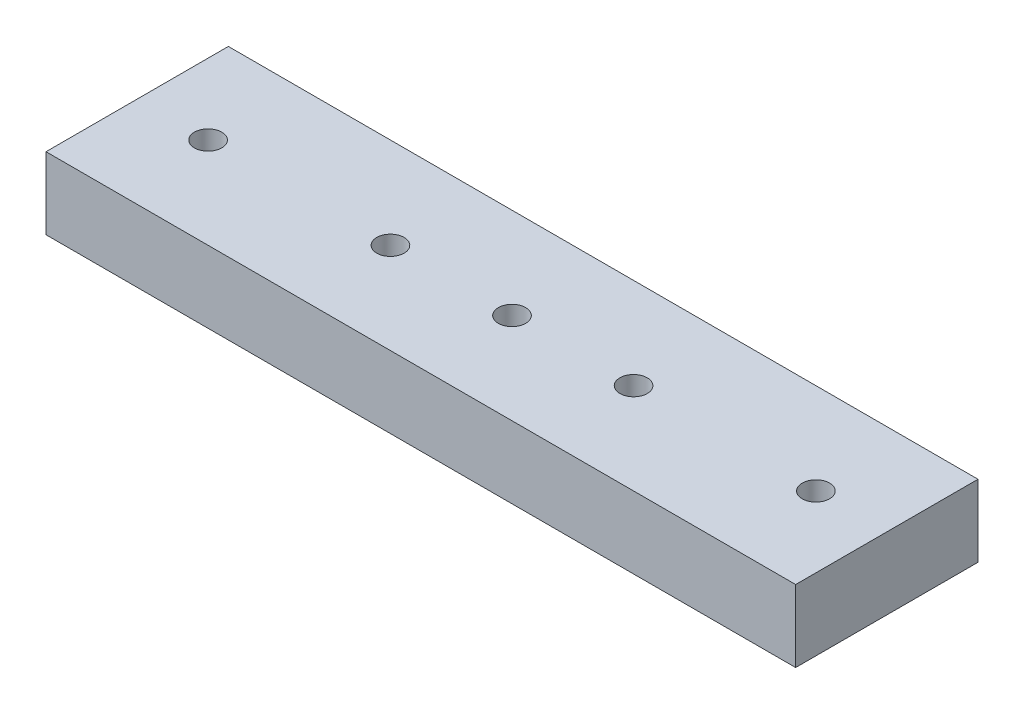
ISO-10303-21;
HEADER;
FILE_DESCRIPTION(('STEP AP214'),'2;1');
FILE_NAME('part.step','',(''),(''),'','','');
FILE_SCHEMA(('AUTOMOTIVE_DESIGN { 1 0 10303 214 1 1 1 1 }'));
ENDSEC;
DATA;
#1=APPLICATION_CONTEXT('core data for automotive mechanical design processes');
#2=APPLICATION_PROTOCOL_DEFINITION('international standard','automotive_design',2000,#1);
#3=PRODUCT_CONTEXT('',#1,'mechanical');
#4=PRODUCT('Part','Part','',(#3));
#5=PRODUCT_RELATED_PRODUCT_CATEGORY('part','',(#4));
#6=PRODUCT_DEFINITION_FORMATION('','',#4);
#7=PRODUCT_DEFINITION_CONTEXT('part definition',#1,'design');
#8=PRODUCT_DEFINITION('design','',#6,#7);
#9=PRODUCT_DEFINITION_SHAPE('','',#8);
#10=(LENGTH_UNIT() NAMED_UNIT(*) SI_UNIT(.MILLI.,.METRE.));
#11=(NAMED_UNIT(*) PLANE_ANGLE_UNIT() SI_UNIT($,.RADIAN.));
#12=(NAMED_UNIT(*) SI_UNIT($,.STERADIAN.) SOLID_ANGLE_UNIT());
#13=UNCERTAINTY_MEASURE_WITH_UNIT(LENGTH_MEASURE(1.E-05),#10,'distance_accuracy_value','');
#14=(GEOMETRIC_REPRESENTATION_CONTEXT(3) GLOBAL_UNCERTAINTY_ASSIGNED_CONTEXT((#13)) GLOBAL_UNIT_ASSIGNED_CONTEXT((#10,
#11,#12)) REPRESENTATION_CONTEXT('',''));
#15=CARTESIAN_POINT('',(0.,0.,0.));
#16=DIRECTION('',(0.,0.,1.));
#17=DIRECTION('',(1.,0.,0.));
#18=AXIS2_PLACEMENT_3D('',#15,#16,#17);
#19=CARTESIAN_POINT('',(-185.,35.5,45.));
#20=DIRECTION('',(1.,0.,0.));
#21=DIRECTION('',(0.,0.,-1.));
#22=AXIS2_PLACEMENT_3D('',#19,#20,#21);
#23=PLANE('',#22);
#24=DIRECTION('',(0.,0.,1.));
#25=VECTOR('',#24,1.);
#26=CARTESIAN_POINT('',(-185.,0.,45.));
#27=LINE('',#26,#25);
#28=CARTESIAN_POINT('',(-185.,0.,-45.));
#29=VERTEX_POINT('',#28);
#30=CARTESIAN_POINT('',(-185.,0.,45.));
#31=VERTEX_POINT('',#30);
#32=EDGE_CURVE('E199',#29,#31,#27,.T.);
#33=ORIENTED_EDGE('',*,*,#32,.T.);
#34=DIRECTION('',(0.,-1.,0.));
#35=VECTOR('',#34,1.);
#36=CARTESIAN_POINT('',(-185.,35.5,45.));
#37=LINE('',#36,#35);
#38=CARTESIAN_POINT('',(-185.,35.5,45.));
#39=VERTEX_POINT('',#38);
#40=EDGE_CURVE('E11',#39,#31,#37,.T.);
#41=ORIENTED_EDGE('',*,*,#40,.F.);
#42=DIRECTION('',(0.,0.,1.));
#43=VECTOR('',#42,1.);
#44=CARTESIAN_POINT('',(-185.,35.5,45.));
#45=LINE('',#44,#43);
#46=CARTESIAN_POINT('',(-185.,35.5,-45.));
#47=VERTEX_POINT('',#46);
#48=EDGE_CURVE('E200',#47,#39,#45,.T.);
#49=ORIENTED_EDGE('',*,*,#48,.F.);
#50=DIRECTION('',(0.,-1.,0.));
#51=VECTOR('',#50,1.);
#52=CARTESIAN_POINT('',(-185.,35.5,-45.));
#53=LINE('',#52,#51);
#54=EDGE_CURVE('E206',#47,#29,#53,.T.);
#55=ORIENTED_EDGE('',*,*,#54,.T.);
#56=EDGE_LOOP('',(#33,#41,#49,#55));
#57=FACE_BOUND('',#56,.T.);
#58=ADVANCED_FACE('F37',(#57),#23,.F.);
#59=CARTESIAN_POINT('',(185.,35.5,45.));
#60=DIRECTION('',(0.,0.,-1.));
#61=DIRECTION('',(-1.,0.,0.));
#62=AXIS2_PLACEMENT_3D('',#59,#60,#61);
#63=PLANE('',#62);
#64=DIRECTION('',(1.,0.,0.));
#65=VECTOR('',#64,1.);
#66=CARTESIAN_POINT('',(185.,0.,45.));
#67=LINE('',#66,#65);
#68=CARTESIAN_POINT('',(185.,0.,45.));
#69=VERTEX_POINT('',#68);
#70=EDGE_CURVE('E209',#31,#69,#67,.T.);
#71=ORIENTED_EDGE('',*,*,#70,.T.);
#72=DIRECTION('',(0.,-1.,0.));
#73=VECTOR('',#72,1.);
#74=CARTESIAN_POINT('',(185.,35.5,45.));
#75=LINE('',#74,#73);
#76=CARTESIAN_POINT('',(185.,35.5,45.));
#77=VERTEX_POINT('',#76);
#78=EDGE_CURVE('E44',#77,#69,#75,.T.);
#79=ORIENTED_EDGE('',*,*,#78,.F.);
#80=DIRECTION('',(1.,0.,0.));
#81=VECTOR('',#80,1.);
#82=CARTESIAN_POINT('',(185.,35.5,45.));
#83=LINE('',#82,#81);
#84=EDGE_CURVE('E88',#39,#77,#83,.T.);
#85=ORIENTED_EDGE('',*,*,#84,.F.);
#86=ORIENTED_EDGE('',*,*,#40,.T.);
#87=EDGE_LOOP('',(#71,#79,#85,#86));
#88=FACE_BOUND('',#87,.T.);
#89=ADVANCED_FACE('F238',(#88),#63,.F.);
#90=CARTESIAN_POINT('',(185.,35.5,45.));
#91=DIRECTION('',(-1.,0.,0.));
#92=DIRECTION('',(0.,0.,1.));
#93=AXIS2_PLACEMENT_3D('',#90,#91,#92);
#94=PLANE('',#93);
#95=DIRECTION('',(0.,0.,-1.));
#96=VECTOR('',#95,1.);
#97=CARTESIAN_POINT('',(185.,0.,45.));
#98=LINE('',#97,#96);
#99=CARTESIAN_POINT('',(185.,0.,-45.));
#100=VERTEX_POINT('',#99);
#101=EDGE_CURVE('E211',#69,#100,#98,.T.);
#102=ORIENTED_EDGE('',*,*,#101,.T.);
#103=DIRECTION('',(0.,-1.,0.));
#104=VECTOR('',#103,1.);
#105=CARTESIAN_POINT('',(185.,35.5,-45.));
#106=LINE('',#105,#104);
#107=CARTESIAN_POINT('',(185.,35.5,-45.));
#108=VERTEX_POINT('',#107);
#109=EDGE_CURVE('E215',#108,#100,#106,.T.);
#110=ORIENTED_EDGE('',*,*,#109,.F.);
#111=DIRECTION('',(0.,0.,-1.));
#112=VECTOR('',#111,1.);
#113=CARTESIAN_POINT('',(185.,35.5,45.));
#114=LINE('',#113,#112);
#115=EDGE_CURVE('E203',#77,#108,#114,.T.);
#116=ORIENTED_EDGE('',*,*,#115,.F.);
#117=ORIENTED_EDGE('',*,*,#78,.T.);
#118=EDGE_LOOP('',(#102,#110,#116,#117));
#119=FACE_BOUND('',#118,.T.);
#120=ADVANCED_FACE('F220',(#119),#94,.F.);
#121=CARTESIAN_POINT('',(185.,35.5,-45.));
#122=DIRECTION('',(0.,0.,1.));
#123=DIRECTION('',(1.,0.,0.));
#124=AXIS2_PLACEMENT_3D('',#121,#122,#123);
#125=PLANE('',#124);
#126=DIRECTION('',(-1.,0.,0.));
#127=VECTOR('',#126,1.);
#128=CARTESIAN_POINT('',(185.,0.,-45.));
#129=LINE('',#128,#127);
#130=EDGE_CURVE('E81',#100,#29,#129,.T.);
#131=ORIENTED_EDGE('',*,*,#130,.T.);
#132=ORIENTED_EDGE('',*,*,#54,.F.);
#133=DIRECTION('',(-1.,0.,0.));
#134=VECTOR('',#133,1.);
#135=CARTESIAN_POINT('',(185.,35.5,-45.));
#136=LINE('',#135,#134);
#137=EDGE_CURVE('E60',#108,#47,#136,.T.);
#138=ORIENTED_EDGE('',*,*,#137,.F.);
#139=ORIENTED_EDGE('',*,*,#109,.T.);
#140=EDGE_LOOP('',(#131,#132,#138,#139));
#141=FACE_BOUND('',#140,.T.);
#142=ADVANCED_FACE('F228',(#141),#125,.F.);
#143=CARTESIAN_POINT('',(0.,35.5,0.));
#144=DIRECTION('',(0.,1.,0.));
#145=DIRECTION('',(0.,0.,1.));
#146=AXIS2_PLACEMENT_3D('',#143,#144,#145);
#147=PLANE('',#146);
#148=CARTESIAN_POINT('',(0.,35.5,0.));
#149=DIRECTION('',(0.,-1.,0.));
#150=DIRECTION('',(0.,0.,-1.));
#151=AXIS2_PLACEMENT_3D('',#148,#149,#150);
#152=CIRCLE('',#151,6.74999999999999);
#153=CARTESIAN_POINT('',(0.,35.5,-6.74999999999999));
#154=VERTEX_POINT('',#153);
#155=EDGE_CURVE('E136',#154,#154,#152,.T.);
#156=ORIENTED_EDGE('',*,*,#155,.T.);
#157=EDGE_LOOP('',(#156));
#158=FACE_BOUND('',#157,.T.);
#159=CARTESIAN_POINT('',(150.,35.5,0.));
#160=DIRECTION('',(0.,-1.,0.));
#161=DIRECTION('',(0.,0.,-1.));
#162=AXIS2_PLACEMENT_3D('',#159,#160,#161);
#163=CIRCLE('',#162,6.74999999999998);
#164=CARTESIAN_POINT('',(150.,35.5,-6.74999999999998));
#165=VERTEX_POINT('',#164);
#166=EDGE_CURVE('E160',#165,#165,#163,.T.);
#167=ORIENTED_EDGE('',*,*,#166,.T.);
#168=EDGE_LOOP('',(#167));
#169=FACE_BOUND('',#168,.T.);
#170=CARTESIAN_POINT('',(60.,35.5,0.));
#171=DIRECTION('',(0.,-1.,0.));
#172=DIRECTION('',(0.,0.,-1.));
#173=AXIS2_PLACEMENT_3D('',#170,#171,#172);
#174=CIRCLE('',#173,6.74999999999999);
#175=CARTESIAN_POINT('',(60.,35.5,-6.74999999999999));
#176=VERTEX_POINT('',#175);
#177=EDGE_CURVE('E172',#176,#176,#174,.T.);
#178=ORIENTED_EDGE('',*,*,#177,.T.);
#179=EDGE_LOOP('',(#178));
#180=FACE_BOUND('',#179,.T.);
#181=CARTESIAN_POINT('',(-60.,35.5,0.));
#182=DIRECTION('',(0.,-1.,0.));
#183=DIRECTION('',(0.,0.,-1.));
#184=AXIS2_PLACEMENT_3D('',#181,#182,#183);
#185=CIRCLE('',#184,6.74999999999999);
#186=CARTESIAN_POINT('',(-60.,35.5,-6.74999999999999));
#187=VERTEX_POINT('',#186);
#188=EDGE_CURVE('E184',#187,#187,#185,.T.);
#189=ORIENTED_EDGE('',*,*,#188,.T.);
#190=EDGE_LOOP('',(#189));
#191=FACE_BOUND('',#190,.T.);
#192=CARTESIAN_POINT('',(-150.,35.5,0.));
#193=DIRECTION('',(0.,-1.,0.));
#194=DIRECTION('',(0.,0.,-1.));
#195=AXIS2_PLACEMENT_3D('',#192,#193,#194);
#196=CIRCLE('',#195,6.74999999999998);
#197=CARTESIAN_POINT('',(-150.,35.5,-6.74999999999998));
#198=VERTEX_POINT('',#197);
#199=EDGE_CURVE('E196',#198,#198,#196,.T.);
#200=ORIENTED_EDGE('',*,*,#199,.T.);
#201=EDGE_LOOP('',(#200));
#202=FACE_BOUND('',#201,.T.);
#203=ORIENTED_EDGE('',*,*,#48,.T.);
#204=ORIENTED_EDGE('',*,*,#84,.T.);
#205=ORIENTED_EDGE('',*,*,#115,.T.);
#206=ORIENTED_EDGE('',*,*,#137,.T.);
#207=EDGE_LOOP('',(#203,#204,#205,#206));
#208=FACE_BOUND('',#207,.T.);
#209=ADVANCED_FACE('F230',(#158,#169,#180,#191,#202,#208),#147,.T.);
#210=CARTESIAN_POINT('',(0.,0.,0.));
#211=DIRECTION('',(0.,1.,0.));
#212=DIRECTION('',(0.,0.,1.));
#213=AXIS2_PLACEMENT_3D('',#210,#211,#212);
#214=PLANE('',#213);
#215=DIRECTION('',(0.,0.,1.));
#216=VECTOR('',#215,1.);
#217=CARTESIAN_POINT('',(12.5,0.,-22.5));
#218=LINE('',#217,#216);
#219=CARTESIAN_POINT('',(12.5,0.,-22.5));
#220=VERTEX_POINT('',#219);
#221=CARTESIAN_POINT('',(12.5,0.,22.5));
#222=VERTEX_POINT('',#221);
#223=EDGE_CURVE('E142',#220,#222,#218,.T.);
#224=ORIENTED_EDGE('',*,*,#223,.F.);
#225=CARTESIAN_POINT('',(0.,0.,-22.5));
#226=DIRECTION('',(0.,-1.,0.));
#227=DIRECTION('',(0.,0.,-1.));
#228=AXIS2_PLACEMENT_3D('',#225,#226,#227);
#229=CIRCLE('',#228,12.5);
#230=CARTESIAN_POINT('',(-12.5,0.,-22.5));
#231=VERTEX_POINT('',#230);
#232=EDGE_CURVE('E51',#231,#220,#229,.T.);
#233=ORIENTED_EDGE('',*,*,#232,.F.);
#234=DIRECTION('',(0.,0.,-1.));
#235=VECTOR('',#234,1.);
#236=CARTESIAN_POINT('',(-12.5,0.,-22.5));
#237=LINE('',#236,#235);
#238=CARTESIAN_POINT('',(-12.5,0.,22.5));
#239=VERTEX_POINT('',#238);
#240=EDGE_CURVE('E130',#239,#231,#237,.T.);
#241=ORIENTED_EDGE('',*,*,#240,.F.);
#242=CARTESIAN_POINT('',(0.,0.,22.5));
#243=DIRECTION('',(0.,-1.,0.));
#244=DIRECTION('',(0.,0.,-1.));
#245=AXIS2_PLACEMENT_3D('',#242,#243,#244);
#246=CIRCLE('',#245,12.5);
#247=EDGE_CURVE('E133',#222,#239,#246,.T.);
#248=ORIENTED_EDGE('',*,*,#247,.F.);
#249=EDGE_LOOP('',(#224,#233,#241,#248));
#250=FACE_BOUND('',#249,.T.);
#251=CARTESIAN_POINT('',(150.,0.,0.));
#252=DIRECTION('',(0.,-1.,0.));
#253=DIRECTION('',(0.,0.,-1.));
#254=AXIS2_PLACEMENT_3D('',#251,#252,#253);
#255=CIRCLE('',#254,10.);
#256=CARTESIAN_POINT('',(150.,0.,-10.));
#257=VERTEX_POINT('',#256);
#258=EDGE_CURVE('E148',#257,#257,#255,.T.);
#259=ORIENTED_EDGE('',*,*,#258,.F.);
#260=EDGE_LOOP('',(#259));
#261=FACE_BOUND('',#260,.T.);
#262=CARTESIAN_POINT('',(60.,0.,0.));
#263=DIRECTION('',(0.,-1.,0.));
#264=DIRECTION('',(0.,0.,-1.));
#265=AXIS2_PLACEMENT_3D('',#262,#263,#264);
#266=CIRCLE('',#265,9.99999999999999);
#267=CARTESIAN_POINT('',(60.,0.,-9.99999999999999));
#268=VERTEX_POINT('',#267);
#269=EDGE_CURVE('E163',#268,#268,#266,.T.);
#270=ORIENTED_EDGE('',*,*,#269,.F.);
#271=EDGE_LOOP('',(#270));
#272=FACE_BOUND('',#271,.T.);
#273=CARTESIAN_POINT('',(-60.,0.,0.));
#274=DIRECTION('',(0.,-1.,0.));
#275=DIRECTION('',(0.,0.,-1.));
#276=AXIS2_PLACEMENT_3D('',#273,#274,#275);
#277=CIRCLE('',#276,10.);
#278=CARTESIAN_POINT('',(-60.,0.,-10.));
#279=VERTEX_POINT('',#278);
#280=EDGE_CURVE('E175',#279,#279,#277,.T.);
#281=ORIENTED_EDGE('',*,*,#280,.F.);
#282=EDGE_LOOP('',(#281));
#283=FACE_BOUND('',#282,.T.);
#284=CARTESIAN_POINT('',(-150.,0.,0.));
#285=DIRECTION('',(0.,-1.,0.));
#286=DIRECTION('',(0.,0.,-1.));
#287=AXIS2_PLACEMENT_3D('',#284,#285,#286);
#288=CIRCLE('',#287,10.);
#289=CARTESIAN_POINT('',(-150.,0.,-10.));
#290=VERTEX_POINT('',#289);
#291=EDGE_CURVE('E187',#290,#290,#288,.T.);
#292=ORIENTED_EDGE('',*,*,#291,.F.);
#293=EDGE_LOOP('',(#292));
#294=FACE_BOUND('',#293,.T.);
#295=ORIENTED_EDGE('',*,*,#32,.F.);
#296=ORIENTED_EDGE('',*,*,#130,.F.);
#297=ORIENTED_EDGE('',*,*,#101,.F.);
#298=ORIENTED_EDGE('',*,*,#70,.F.);
#299=EDGE_LOOP('',(#295,#296,#297,#298));
#300=FACE_BOUND('',#299,.T.);
#301=ADVANCED_FACE('F224',(#250,#261,#272,#283,#294,#300),#214,.F.);
#302=CARTESIAN_POINT('',(-150.,0.,0.));
#303=DIRECTION('',(0.,-1.,0.));
#304=DIRECTION('',(0.,0.,-1.));
#305=AXIS2_PLACEMENT_3D('',#302,#303,#304);
#306=CYLINDRICAL_SURFACE('',#305,6.74999999999999);
#307=ORIENTED_EDGE('',*,*,#199,.F.);
#308=EDGE_LOOP('',(#307));
#309=FACE_BOUND('',#308,.T.);
#310=CARTESIAN_POINT('',(-150.,13.,0.));
#311=DIRECTION('',(0.,-1.,0.));
#312=DIRECTION('',(0.,0.,-1.));
#313=AXIS2_PLACEMENT_3D('',#310,#311,#312);
#314=CIRCLE('',#313,6.75000000000001);
#315=CARTESIAN_POINT('',(-150.,13.,-6.75000000000001));
#316=VERTEX_POINT('',#315);
#317=EDGE_CURVE('E193',#316,#316,#314,.T.);
#318=ORIENTED_EDGE('',*,*,#317,.T.);
#319=EDGE_LOOP('',(#318));
#320=FACE_BOUND('',#319,.T.);
#321=ADVANCED_FACE('F261',(#309,#320),#306,.F.);
#322=CARTESIAN_POINT('',(-143.25,13.,0.));
#323=DIRECTION('',(0.,1.,0.));
#324=DIRECTION('',(0.,0.,1.));
#325=AXIS2_PLACEMENT_3D('',#322,#323,#324);
#326=PLANE('',#325);
#327=ORIENTED_EDGE('',*,*,#317,.F.);
#328=EDGE_LOOP('',(#327));
#329=FACE_BOUND('',#328,.T.);
#330=CARTESIAN_POINT('',(-150.,13.,0.));
#331=DIRECTION('',(0.,-1.,0.));
#332=DIRECTION('',(0.,0.,-1.));
#333=AXIS2_PLACEMENT_3D('',#330,#331,#332);
#334=CIRCLE('',#333,10.);
#335=CARTESIAN_POINT('',(-150.,13.,-10.));
#336=VERTEX_POINT('',#335);
#337=EDGE_CURVE('E190',#336,#336,#334,.T.);
#338=ORIENTED_EDGE('',*,*,#337,.T.);
#339=EDGE_LOOP('',(#338));
#340=FACE_BOUND('',#339,.T.);
#341=ADVANCED_FACE('F266',(#329,#340),#326,.F.);
#342=CARTESIAN_POINT('',(-150.,0.,0.));
#343=DIRECTION('',(0.,-1.,0.));
#344=DIRECTION('',(0.,0.,-1.));
#345=AXIS2_PLACEMENT_3D('',#342,#343,#344);
#346=CYLINDRICAL_SURFACE('',#345,10.);
#347=ORIENTED_EDGE('',*,*,#337,.F.);
#348=EDGE_LOOP('',(#347));
#349=FACE_BOUND('',#348,.T.);
#350=ORIENTED_EDGE('',*,*,#291,.T.);
#351=EDGE_LOOP('',(#350));
#352=FACE_BOUND('',#351,.T.);
#353=ADVANCED_FACE('F278',(#349,#352),#346,.F.);
#354=CARTESIAN_POINT('',(-60.,0.,0.));
#355=DIRECTION('',(0.,-1.,0.));
#356=DIRECTION('',(0.,0.,-1.));
#357=AXIS2_PLACEMENT_3D('',#354,#355,#356);
#358=CYLINDRICAL_SURFACE('',#357,6.75);
#359=ORIENTED_EDGE('',*,*,#188,.F.);
#360=EDGE_LOOP('',(#359));
#361=FACE_BOUND('',#360,.T.);
#362=CARTESIAN_POINT('',(-60.,13.,0.));
#363=DIRECTION('',(0.,-1.,0.));
#364=DIRECTION('',(0.,0.,-1.));
#365=AXIS2_PLACEMENT_3D('',#362,#363,#364);
#366=CIRCLE('',#365,6.75);
#367=CARTESIAN_POINT('',(-60.,13.,-6.75));
#368=VERTEX_POINT('',#367);
#369=EDGE_CURVE('E181',#368,#368,#366,.T.);
#370=ORIENTED_EDGE('',*,*,#369,.T.);
#371=EDGE_LOOP('',(#370));
#372=FACE_BOUND('',#371,.T.);
#373=ADVANCED_FACE('F289',(#361,#372),#358,.F.);
#374=CARTESIAN_POINT('',(-53.25,13.,0.));
#375=DIRECTION('',(0.,1.,0.));
#376=DIRECTION('',(0.,0.,1.));
#377=AXIS2_PLACEMENT_3D('',#374,#375,#376);
#378=PLANE('',#377);
#379=ORIENTED_EDGE('',*,*,#369,.F.);
#380=EDGE_LOOP('',(#379));
#381=FACE_BOUND('',#380,.T.);
#382=CARTESIAN_POINT('',(-60.,13.,0.));
#383=DIRECTION('',(0.,-1.,0.));
#384=DIRECTION('',(0.,0.,-1.));
#385=AXIS2_PLACEMENT_3D('',#382,#383,#384);
#386=CIRCLE('',#385,9.99999999999999);
#387=CARTESIAN_POINT('',(-60.,13.,-9.99999999999999));
#388=VERTEX_POINT('',#387);
#389=EDGE_CURVE('E178',#388,#388,#386,.T.);
#390=ORIENTED_EDGE('',*,*,#389,.T.);
#391=EDGE_LOOP('',(#390));
#392=FACE_BOUND('',#391,.T.);
#393=ADVANCED_FACE('F300',(#381,#392),#378,.F.);
#394=CARTESIAN_POINT('',(-60.,0.,0.));
#395=DIRECTION('',(0.,-1.,0.));
#396=DIRECTION('',(0.,0.,-1.));
#397=AXIS2_PLACEMENT_3D('',#394,#395,#396);
#398=CYLINDRICAL_SURFACE('',#397,10.);
#399=ORIENTED_EDGE('',*,*,#389,.F.);
#400=EDGE_LOOP('',(#399));
#401=FACE_BOUND('',#400,.T.);
#402=ORIENTED_EDGE('',*,*,#280,.T.);
#403=EDGE_LOOP('',(#402));
#404=FACE_BOUND('',#403,.T.);
#405=ADVANCED_FACE('F310',(#401,#404),#398,.F.);
#406=CARTESIAN_POINT('',(60.,0.,0.));
#407=DIRECTION('',(0.,-1.,0.));
#408=DIRECTION('',(0.,0.,-1.));
#409=AXIS2_PLACEMENT_3D('',#406,#407,#408);
#410=CYLINDRICAL_SURFACE('',#409,6.75);
#411=ORIENTED_EDGE('',*,*,#177,.F.);
#412=EDGE_LOOP('',(#411));
#413=FACE_BOUND('',#412,.T.);
#414=CARTESIAN_POINT('',(60.,13.,0.));
#415=DIRECTION('',(0.,-1.,0.));
#416=DIRECTION('',(0.,0.,-1.));
#417=AXIS2_PLACEMENT_3D('',#414,#415,#416);
#418=CIRCLE('',#417,6.75000000000001);
#419=CARTESIAN_POINT('',(60.,13.,-6.75000000000001));
#420=VERTEX_POINT('',#419);
#421=EDGE_CURVE('E169',#420,#420,#418,.T.);
#422=ORIENTED_EDGE('',*,*,#421,.T.);
#423=EDGE_LOOP('',(#422));
#424=FACE_BOUND('',#423,.T.);
#425=ADVANCED_FACE('F320',(#413,#424),#410,.F.);
#426=CARTESIAN_POINT('',(66.75,13.,0.));
#427=DIRECTION('',(0.,1.,0.));
#428=DIRECTION('',(0.,0.,1.));
#429=AXIS2_PLACEMENT_3D('',#426,#427,#428);
#430=PLANE('',#429);
#431=ORIENTED_EDGE('',*,*,#421,.F.);
#432=EDGE_LOOP('',(#431));
#433=FACE_BOUND('',#432,.T.);
#434=CARTESIAN_POINT('',(60.,13.,0.));
#435=DIRECTION('',(0.,-1.,0.));
#436=DIRECTION('',(0.,0.,-1.));
#437=AXIS2_PLACEMENT_3D('',#434,#435,#436);
#438=CIRCLE('',#437,9.99999999999999);
#439=CARTESIAN_POINT('',(60.,13.,-9.99999999999999));
#440=VERTEX_POINT('',#439);
#441=EDGE_CURVE('E166',#440,#440,#438,.T.);
#442=ORIENTED_EDGE('',*,*,#441,.T.);
#443=EDGE_LOOP('',(#442));
#444=FACE_BOUND('',#443,.T.);
#445=ADVANCED_FACE('F331',(#433,#444),#430,.F.);
#446=CARTESIAN_POINT('',(60.,0.,0.));
#447=DIRECTION('',(0.,-1.,0.));
#448=DIRECTION('',(0.,0.,-1.));
#449=AXIS2_PLACEMENT_3D('',#446,#447,#448);
#450=CYLINDRICAL_SURFACE('',#449,9.99999999999999);
#451=ORIENTED_EDGE('',*,*,#441,.F.);
#452=EDGE_LOOP('',(#451));
#453=FACE_BOUND('',#452,.T.);
#454=ORIENTED_EDGE('',*,*,#269,.T.);
#455=EDGE_LOOP('',(#454));
#456=FACE_BOUND('',#455,.T.);
#457=ADVANCED_FACE('F341',(#453,#456),#450,.F.);
#458=CARTESIAN_POINT('',(150.,0.,0.));
#459=DIRECTION('',(0.,-1.,0.));
#460=DIRECTION('',(0.,0.,-1.));
#461=AXIS2_PLACEMENT_3D('',#458,#459,#460);
#462=CYLINDRICAL_SURFACE('',#461,6.74999999999999);
#463=ORIENTED_EDGE('',*,*,#166,.F.);
#464=EDGE_LOOP('',(#463));
#465=FACE_BOUND('',#464,.T.);
#466=CARTESIAN_POINT('',(150.,13.,0.));
#467=DIRECTION('',(0.,-1.,0.));
#468=DIRECTION('',(0.,0.,-1.));
#469=AXIS2_PLACEMENT_3D('',#466,#467,#468);
#470=CIRCLE('',#469,6.75000000000001);
#471=CARTESIAN_POINT('',(150.,13.,-6.75000000000001));
#472=VERTEX_POINT('',#471);
#473=EDGE_CURVE('E157',#472,#472,#470,.T.);
#474=ORIENTED_EDGE('',*,*,#473,.T.);
#475=EDGE_LOOP('',(#474));
#476=FACE_BOUND('',#475,.T.);
#477=ADVANCED_FACE('F351',(#465,#476),#462,.F.);
#478=CARTESIAN_POINT('',(156.75,13.,0.));
#479=DIRECTION('',(0.,1.,0.));
#480=DIRECTION('',(0.,0.,1.));
#481=AXIS2_PLACEMENT_3D('',#478,#479,#480);
#482=PLANE('',#481);
#483=ORIENTED_EDGE('',*,*,#473,.F.);
#484=EDGE_LOOP('',(#483));
#485=FACE_BOUND('',#484,.T.);
#486=CARTESIAN_POINT('',(150.,13.,0.));
#487=DIRECTION('',(0.,-1.,0.));
#488=DIRECTION('',(0.,0.,-1.));
#489=AXIS2_PLACEMENT_3D('',#486,#487,#488);
#490=CIRCLE('',#489,10.);
#491=CARTESIAN_POINT('',(150.,13.,-10.));
#492=VERTEX_POINT('',#491);
#493=EDGE_CURVE('E154',#492,#492,#490,.T.);
#494=ORIENTED_EDGE('',*,*,#493,.T.);
#495=EDGE_LOOP('',(#494));
#496=FACE_BOUND('',#495,.T.);
#497=ADVANCED_FACE('F362',(#485,#496),#482,.F.);
#498=CARTESIAN_POINT('',(150.,0.,0.));
#499=DIRECTION('',(0.,-1.,0.));
#500=DIRECTION('',(0.,0.,-1.));
#501=AXIS2_PLACEMENT_3D('',#498,#499,#500);
#502=CYLINDRICAL_SURFACE('',#501,10.);
#503=ORIENTED_EDGE('',*,*,#493,.F.);
#504=EDGE_LOOP('',(#503));
#505=FACE_BOUND('',#504,.T.);
#506=ORIENTED_EDGE('',*,*,#258,.T.);
#507=EDGE_LOOP('',(#506));
#508=FACE_BOUND('',#507,.T.);
#509=ADVANCED_FACE('F372',(#505,#508),#502,.F.);
#510=CARTESIAN_POINT('',(0.,13.,-22.5));
#511=DIRECTION('',(0.,-1.,0.));
#512=DIRECTION('',(0.,0.,-1.));
#513=AXIS2_PLACEMENT_3D('',#510,#511,#512);
#514=CYLINDRICAL_SURFACE('',#513,12.5);
#515=ORIENTED_EDGE('',*,*,#232,.T.);
#516=DIRECTION('',(0.,-1.,0.));
#517=VECTOR('',#516,1.);
#518=CARTESIAN_POINT('',(12.5,13.,-22.5));
#519=LINE('',#518,#517);
#520=CARTESIAN_POINT('',(12.5,13.,-22.5));
#521=VERTEX_POINT('',#520);
#522=EDGE_CURVE('E108',#521,#220,#519,.T.);
#523=ORIENTED_EDGE('',*,*,#522,.F.);
#524=CARTESIAN_POINT('',(0.,13.,-22.5));
#525=DIRECTION('',(0.,-1.,0.));
#526=DIRECTION('',(0.,0.,-1.));
#527=AXIS2_PLACEMENT_3D('',#524,#525,#526);
#528=CIRCLE('',#527,12.5);
#529=CARTESIAN_POINT('',(-12.5,13.,-22.5));
#530=VERTEX_POINT('',#529);
#531=EDGE_CURVE('E112',#530,#521,#528,.T.);
#532=ORIENTED_EDGE('',*,*,#531,.F.);
#533=DIRECTION('',(0.,-1.,0.));
#534=VECTOR('',#533,1.);
#535=CARTESIAN_POINT('',(-12.5,13.,-22.5));
#536=LINE('',#535,#534);
#537=EDGE_CURVE('E146',#530,#231,#536,.T.);
#538=ORIENTED_EDGE('',*,*,#537,.T.);
#539=EDGE_LOOP('',(#515,#523,#532,#538));
#540=FACE_BOUND('',#539,.T.);
#541=ADVANCED_FACE('F110',(#540),#514,.F.);
#542=CARTESIAN_POINT('',(-12.5,13.,-22.5));
#543=DIRECTION('',(-1.,0.,0.));
#544=DIRECTION('',(0.,0.,1.));
#545=AXIS2_PLACEMENT_3D('',#542,#543,#544);
#546=PLANE('',#545);
#547=ORIENTED_EDGE('',*,*,#240,.T.);
#548=ORIENTED_EDGE('',*,*,#537,.F.);
#549=DIRECTION('',(0.,0.,-1.));
#550=VECTOR('',#549,1.);
#551=CARTESIAN_POINT('',(-12.5,13.,-22.5));
#552=LINE('',#551,#550);
#553=CARTESIAN_POINT('',(-12.5,13.,22.5));
#554=VERTEX_POINT('',#553);
#555=EDGE_CURVE('E118',#554,#530,#552,.T.);
#556=ORIENTED_EDGE('',*,*,#555,.F.);
#557=DIRECTION('',(0.,-1.,0.));
#558=VECTOR('',#557,1.);
#559=CARTESIAN_POINT('',(-12.5,13.,22.5));
#560=LINE('',#559,#558);
#561=EDGE_CURVE('E149',#554,#239,#560,.T.);
#562=ORIENTED_EDGE('',*,*,#561,.T.);
#563=EDGE_LOOP('',(#547,#548,#556,#562));
#564=FACE_BOUND('',#563,.T.);
#565=ADVANCED_FACE('F397',(#564),#546,.F.);
#566=CARTESIAN_POINT('',(0.,13.,22.5));
#567=DIRECTION('',(0.,-1.,0.));
#568=DIRECTION('',(0.,0.,-1.));
#569=AXIS2_PLACEMENT_3D('',#566,#567,#568);
#570=CYLINDRICAL_SURFACE('',#569,12.5);
#571=ORIENTED_EDGE('',*,*,#247,.T.);
#572=ORIENTED_EDGE('',*,*,#561,.F.);
#573=CARTESIAN_POINT('',(0.,13.,22.5));
#574=DIRECTION('',(0.,-1.,0.));
#575=DIRECTION('',(0.,0.,-1.));
#576=AXIS2_PLACEMENT_3D('',#573,#574,#575);
#577=CIRCLE('',#576,12.5);
#578=CARTESIAN_POINT('',(12.5,13.,22.5));
#579=VERTEX_POINT('',#578);
#580=EDGE_CURVE('E126',#579,#554,#577,.T.);
#581=ORIENTED_EDGE('',*,*,#580,.F.);
#582=DIRECTION('',(0.,-1.,0.));
#583=VECTOR('',#582,1.);
#584=CARTESIAN_POINT('',(12.5,13.,22.5));
#585=LINE('',#584,#583);
#586=EDGE_CURVE('E117',#579,#222,#585,.T.);
#587=ORIENTED_EDGE('',*,*,#586,.T.);
#588=EDGE_LOOP('',(#571,#572,#581,#587));
#589=FACE_BOUND('',#588,.T.);
#590=ADVANCED_FACE('F406',(#589),#570,.F.);
#591=CARTESIAN_POINT('',(12.5,13.,-22.5));
#592=DIRECTION('',(1.,0.,0.));
#593=DIRECTION('',(0.,0.,-1.));
#594=AXIS2_PLACEMENT_3D('',#591,#592,#593);
#595=PLANE('',#594);
#596=ORIENTED_EDGE('',*,*,#223,.T.);
#597=ORIENTED_EDGE('',*,*,#586,.F.);
#598=DIRECTION('',(0.,0.,1.));
#599=VECTOR('',#598,1.);
#600=CARTESIAN_POINT('',(12.5,13.,-22.5));
#601=LINE('',#600,#599);
#602=EDGE_CURVE('E121',#521,#579,#601,.T.);
#603=ORIENTED_EDGE('',*,*,#602,.F.);
#604=ORIENTED_EDGE('',*,*,#522,.T.);
#605=EDGE_LOOP('',(#596,#597,#603,#604));
#606=FACE_BOUND('',#605,.T.);
#607=ADVANCED_FACE('F122',(#606),#595,.F.);
#608=CARTESIAN_POINT('',(0.,13.,-22.5));
#609=DIRECTION('',(0.,-1.,0.));
#610=DIRECTION('',(0.,0.,-1.));
#611=AXIS2_PLACEMENT_3D('',#608,#609,#610);
#612=PLANE('',#611);
#613=CARTESIAN_POINT('',(0.,13.,0.));
#614=DIRECTION('',(0.,-1.,0.));
#615=DIRECTION('',(0.,0.,-1.));
#616=AXIS2_PLACEMENT_3D('',#613,#614,#615);
#617=CIRCLE('',#616,10.);
#618=CARTESIAN_POINT('',(0.,13.,-10.));
#619=VERTEX_POINT('',#618);
#620=EDGE_CURVE('E478',#619,#619,#617,.T.);
#621=ORIENTED_EDGE('',*,*,#620,.F.);
#622=EDGE_LOOP('',(#621));
#623=FACE_BOUND('',#622,.T.);
#624=ORIENTED_EDGE('',*,*,#531,.T.);
#625=ORIENTED_EDGE('',*,*,#602,.T.);
#626=ORIENTED_EDGE('',*,*,#580,.T.);
#627=ORIENTED_EDGE('',*,*,#555,.T.);
#628=EDGE_LOOP('',(#624,#625,#626,#627));
#629=FACE_BOUND('',#628,.T.);
#630=ADVANCED_FACE('F128',(#623,#629),#612,.T.);
#631=CARTESIAN_POINT('',(0.,13.,0.));
#632=DIRECTION('',(0.,-1.,0.));
#633=DIRECTION('',(0.,0.,-1.));
#634=AXIS2_PLACEMENT_3D('',#631,#632,#633);
#635=CYLINDRICAL_SURFACE('',#634,6.75);
#636=ORIENTED_EDGE('',*,*,#155,.F.);
#637=EDGE_LOOP('',(#636));
#638=FACE_BOUND('',#637,.T.);
#639=CARTESIAN_POINT('',(0.,26.,0.));
#640=DIRECTION('',(0.,-1.,0.));
#641=DIRECTION('',(0.,0.,-1.));
#642=AXIS2_PLACEMENT_3D('',#639,#640,#641);
#643=CIRCLE('',#642,6.75000000000001);
#644=CARTESIAN_POINT('',(0.,26.,-6.75000000000001));
#645=VERTEX_POINT('',#644);
#646=EDGE_CURVE('E480',#645,#645,#643,.T.);
#647=ORIENTED_EDGE('',*,*,#646,.T.);
#648=EDGE_LOOP('',(#647));
#649=FACE_BOUND('',#648,.T.);
#650=ADVANCED_FACE('F438',(#638,#649),#635,.F.);
#651=CARTESIAN_POINT('',(6.75000000000001,26.,0.));
#652=DIRECTION('',(0.,1.,0.));
#653=DIRECTION('',(0.,0.,1.));
#654=AXIS2_PLACEMENT_3D('',#651,#652,#653);
#655=PLANE('',#654);
#656=ORIENTED_EDGE('',*,*,#646,.F.);
#657=EDGE_LOOP('',(#656));
#658=FACE_BOUND('',#657,.T.);
#659=CARTESIAN_POINT('',(0.,26.,0.));
#660=DIRECTION('',(0.,-1.,0.));
#661=DIRECTION('',(0.,0.,-1.));
#662=AXIS2_PLACEMENT_3D('',#659,#660,#661);
#663=CIRCLE('',#662,9.99999999999999);
#664=CARTESIAN_POINT('',(0.,26.,-9.99999999999999));
#665=VERTEX_POINT('',#664);
#666=EDGE_CURVE('E475',#665,#665,#663,.T.);
#667=ORIENTED_EDGE('',*,*,#666,.T.);
#668=EDGE_LOOP('',(#667));
#669=FACE_BOUND('',#668,.T.);
#670=ADVANCED_FACE('F448',(#658,#669),#655,.F.);
#671=CARTESIAN_POINT('',(0.,13.,0.));
#672=DIRECTION('',(0.,-1.,0.));
#673=DIRECTION('',(0.,0.,-1.));
#674=AXIS2_PLACEMENT_3D('',#671,#672,#673);
#675=CYLINDRICAL_SURFACE('',#674,9.99999999999999);
#676=ORIENTED_EDGE('',*,*,#666,.F.);
#677=EDGE_LOOP('',(#676));
#678=FACE_BOUND('',#677,.T.);
#679=ORIENTED_EDGE('',*,*,#620,.T.);
#680=EDGE_LOOP('',(#679));
#681=FACE_BOUND('',#680,.T.);
#682=ADVANCED_FACE('F458',(#678,#681),#675,.F.);
#683=CLOSED_SHELL('',(#58,#89,#120,#142,#209,#301,#321,#341,#353,#373,#393,#405,#425,#445,#457,
#477,#497,#509,#541,#565,#590,#607,#630,#650,#670,#682));
#684=MANIFOLD_SOLID_BREP('B2',#683);
#685=ADVANCED_BREP_SHAPE_REPRESENTATION('',(#18,#684),#14);
#686=SHAPE_DEFINITION_REPRESENTATION(#9,#685);
ENDSEC;
END-ISO-10303-21;
